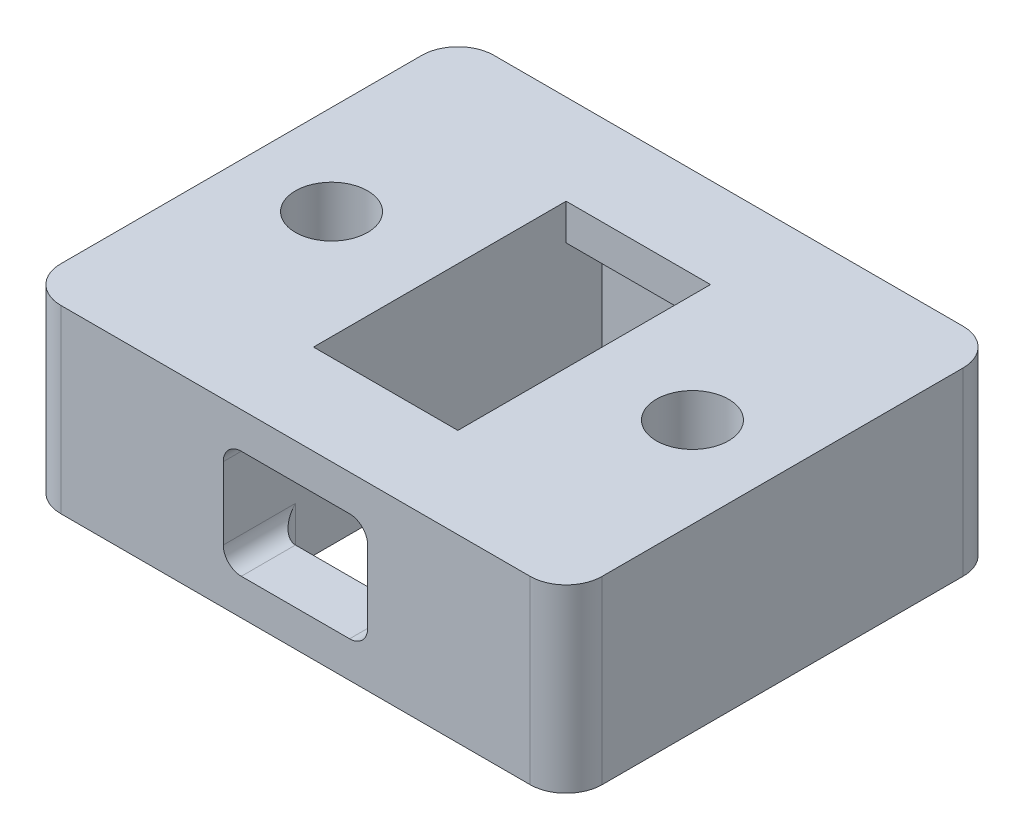
ISO-10303-21;
HEADER;
FILE_DESCRIPTION(('STEP AP214'),'2;1');
FILE_NAME('part.step','',(''),(''),'','','');
FILE_SCHEMA(('AUTOMOTIVE_DESIGN { 1 0 10303 214 1 1 1 1 }'));
ENDSEC;
DATA;
#1=APPLICATION_CONTEXT('core data for automotive mechanical design processes');
#2=APPLICATION_PROTOCOL_DEFINITION('international standard','automotive_design',2000,#1);
#3=PRODUCT_CONTEXT('',#1,'mechanical');
#4=PRODUCT('Part','Part','',(#3));
#5=PRODUCT_RELATED_PRODUCT_CATEGORY('part','',(#4));
#6=PRODUCT_DEFINITION_FORMATION('','',#4);
#7=PRODUCT_DEFINITION_CONTEXT('part definition',#1,'design');
#8=PRODUCT_DEFINITION('design','',#6,#7);
#9=PRODUCT_DEFINITION_SHAPE('','',#8);
#10=(LENGTH_UNIT() NAMED_UNIT(*) SI_UNIT(.MILLI.,.METRE.));
#11=(NAMED_UNIT(*) PLANE_ANGLE_UNIT() SI_UNIT($,.RADIAN.));
#12=(NAMED_UNIT(*) SI_UNIT($,.STERADIAN.) SOLID_ANGLE_UNIT());
#13=UNCERTAINTY_MEASURE_WITH_UNIT(LENGTH_MEASURE(1.E-05),#10,'distance_accuracy_value','');
#14=(GEOMETRIC_REPRESENTATION_CONTEXT(3) GLOBAL_UNCERTAINTY_ASSIGNED_CONTEXT((#13)) GLOBAL_UNIT_ASSIGNED_CONTEXT((#10,
#11,#12)) REPRESENTATION_CONTEXT('',''));
#15=CARTESIAN_POINT('',(0.,0.,0.));
#16=DIRECTION('',(0.,0.,1.));
#17=DIRECTION('',(1.,0.,0.));
#18=AXIS2_PLACEMENT_3D('',#15,#16,#17);
#19=CARTESIAN_POINT('',(-5.08,-12.7,0.));
#20=DIRECTION('',(-1.,0.,0.));
#21=DIRECTION('',(0.,0.,1.));
#22=AXIS2_PLACEMENT_3D('',#19,#20,#21);
#23=PLANE('',#22);
#24=DIRECTION('',(0.,0.,-1.));
#25=VECTOR('',#24,1.);
#26=CARTESIAN_POINT('',(-5.08,-8.89,11.43));
#27=LINE('',#26,#25);
#28=CARTESIAN_POINT('',(-5.08,-8.89,15.24));
#29=VERTEX_POINT('',#28);
#30=CARTESIAN_POINT('',(-5.08,-8.89,10.16));
#31=VERTEX_POINT('',#30);
#32=EDGE_CURVE('E331',#29,#31,#27,.T.);
#33=ORIENTED_EDGE('',*,*,#32,.T.);
#34=DIRECTION('',(0.,1.,0.));
#35=VECTOR('',#34,1.);
#36=CARTESIAN_POINT('',(-5.08,-12.7,10.16));
#37=LINE('',#36,#35);
#38=CARTESIAN_POINT('',(-5.08,-12.7,10.16));
#39=VERTEX_POINT('',#38);
#40=EDGE_CURVE('E333',#31,#39,#37,.F.);
#41=ORIENTED_EDGE('',*,*,#40,.T.);
#42=DIRECTION('',(0.,0.,1.));
#43=VECTOR('',#42,1.);
#44=CARTESIAN_POINT('',(-5.08,-12.7,0.));
#45=LINE('',#44,#43);
#46=CARTESIAN_POINT('',(-5.08,-12.7,-11.43));
#47=VERTEX_POINT('',#46);
#48=EDGE_CURVE('E254',#47,#39,#45,.T.);
#49=ORIENTED_EDGE('',*,*,#48,.F.);
#50=DIRECTION('',(0.,1.,0.));
#51=VECTOR('',#50,1.);
#52=CARTESIAN_POINT('',(-5.08,-12.7,-11.43));
#53=LINE('',#52,#51);
#54=CARTESIAN_POINT('',(-5.08,-2.54,-11.43));
#55=VERTEX_POINT('',#54);
#56=EDGE_CURVE('E217',#47,#55,#53,.T.);
#57=ORIENTED_EDGE('',*,*,#56,.T.);
#58=DIRECTION('',(0.,0.,-1.));
#59=VECTOR('',#58,1.);
#60=CARTESIAN_POINT('',(-5.08,-2.54,-8.89));
#61=LINE('',#60,#59);
#62=CARTESIAN_POINT('',(-5.08,-2.54,-8.89));
#63=VERTEX_POINT('',#62);
#64=EDGE_CURVE('E198',#63,#55,#61,.T.);
#65=ORIENTED_EDGE('',*,*,#64,.F.);
#66=DIRECTION('',(0.,-1.,0.));
#67=VECTOR('',#66,1.);
#68=CARTESIAN_POINT('',(-5.08,0.,-8.89));
#69=LINE('',#68,#67);
#70=CARTESIAN_POINT('',(-5.08,0.,-8.89));
#71=VERTEX_POINT('',#70);
#72=EDGE_CURVE('E205',#71,#63,#69,.T.);
#73=ORIENTED_EDGE('',*,*,#72,.F.);
#74=DIRECTION('',(0.,0.,1.));
#75=VECTOR('',#74,1.);
#76=CARTESIAN_POINT('',(-5.08,0.,0.));
#77=LINE('',#76,#75);
#78=CARTESIAN_POINT('',(-5.08,0.,8.89));
#79=VERTEX_POINT('',#78);
#80=EDGE_CURVE('E230',#71,#79,#77,.T.);
#81=ORIENTED_EDGE('',*,*,#80,.T.);
#82=DIRECTION('',(0.,1.,0.));
#83=VECTOR('',#82,1.);
#84=CARTESIAN_POINT('',(-5.08,0.,8.89));
#85=LINE('',#84,#83);
#86=CARTESIAN_POINT('',(-5.08,-3.81,8.89));
#87=VERTEX_POINT('',#86);
#88=EDGE_CURVE('E408',#87,#79,#85,.T.);
#89=ORIENTED_EDGE('',*,*,#88,.F.);
#90=DIRECTION('',(0.,0.,1.));
#91=VECTOR('',#90,1.);
#92=CARTESIAN_POINT('',(-5.08,-3.81,15.24));
#93=LINE('',#92,#91);
#94=CARTESIAN_POINT('',(-5.08,-3.81,15.24));
#95=VERTEX_POINT('',#94);
#96=EDGE_CURVE('E328',#87,#95,#93,.T.);
#97=ORIENTED_EDGE('',*,*,#96,.T.);
#98=DIRECTION('',(0.,1.,0.));
#99=VECTOR('',#98,1.);
#100=CARTESIAN_POINT('',(-5.08,-2.54,15.24));
#101=LINE('',#100,#99);
#102=EDGE_CURVE('E402',#29,#95,#101,.T.);
#103=ORIENTED_EDGE('',*,*,#102,.F.);
#104=EDGE_LOOP('',(#33,#41,#49,#57,#65,#73,#81,#89,#97,#103));
#105=FACE_BOUND('',#104,.T.);
#106=ADVANCED_FACE('F39',(#105),#23,.F.);
#107=CARTESIAN_POINT('',(5.08,-12.7,0.));
#108=DIRECTION('',(-1.,0.,0.));
#109=DIRECTION('',(0.,0.,1.));
#110=AXIS2_PLACEMENT_3D('',#107,#108,#109);
#111=PLANE('',#110);
#112=DIRECTION('',(0.,0.,1.));
#113=VECTOR('',#112,1.);
#114=CARTESIAN_POINT('',(5.08,-12.7,0.));
#115=LINE('',#114,#113);
#116=CARTESIAN_POINT('',(5.08,-12.7,-11.43));
#117=VERTEX_POINT('',#116);
#118=CARTESIAN_POINT('',(5.08,-12.7,10.16));
#119=VERTEX_POINT('',#118);
#120=EDGE_CURVE('E248',#117,#119,#115,.T.);
#121=ORIENTED_EDGE('',*,*,#120,.T.);
#122=DIRECTION('',(0.,1.,0.));
#123=VECTOR('',#122,1.);
#124=CARTESIAN_POINT('',(5.08,-12.7,10.16));
#125=LINE('',#124,#123);
#126=CARTESIAN_POINT('',(5.08,-8.89,10.16));
#127=VERTEX_POINT('',#126);
#128=EDGE_CURVE('E320',#119,#127,#125,.T.);
#129=ORIENTED_EDGE('',*,*,#128,.T.);
#130=DIRECTION('',(0.,0.,-1.));
#131=VECTOR('',#130,1.);
#132=CARTESIAN_POINT('',(5.08,-8.89,0.));
#133=LINE('',#132,#131);
#134=CARTESIAN_POINT('',(5.08,-8.89,15.24));
#135=VERTEX_POINT('',#134);
#136=EDGE_CURVE('E318',#127,#135,#133,.F.);
#137=ORIENTED_EDGE('',*,*,#136,.T.);
#138=DIRECTION('',(0.,-1.,0.));
#139=VECTOR('',#138,1.);
#140=CARTESIAN_POINT('',(5.08,-2.54,15.24));
#141=LINE('',#140,#139);
#142=CARTESIAN_POINT('',(5.08,-3.81,15.24));
#143=VERTEX_POINT('',#142);
#144=EDGE_CURVE('E364',#143,#135,#141,.T.);
#145=ORIENTED_EDGE('',*,*,#144,.F.);
#146=DIRECTION('',(0.,0.,1.));
#147=VECTOR('',#146,1.);
#148=CARTESIAN_POINT('',(5.08,-3.81,0.));
#149=LINE('',#148,#147);
#150=CARTESIAN_POINT('',(5.08,-3.81,8.89));
#151=VERTEX_POINT('',#150);
#152=EDGE_CURVE('E315',#143,#151,#149,.F.);
#153=ORIENTED_EDGE('',*,*,#152,.T.);
#154=DIRECTION('',(0.,-1.,0.));
#155=VECTOR('',#154,1.);
#156=CARTESIAN_POINT('',(5.08,0.,8.89));
#157=LINE('',#156,#155);
#158=CARTESIAN_POINT('',(5.08,0.,8.89));
#159=VERTEX_POINT('',#158);
#160=EDGE_CURVE('E418',#159,#151,#157,.T.);
#161=ORIENTED_EDGE('',*,*,#160,.F.);
#162=DIRECTION('',(0.,0.,1.));
#163=VECTOR('',#162,1.);
#164=CARTESIAN_POINT('',(5.08,0.,0.));
#165=LINE('',#164,#163);
#166=CARTESIAN_POINT('',(5.08,0.,-8.89));
#167=VERTEX_POINT('',#166);
#168=EDGE_CURVE('E272',#167,#159,#165,.T.);
#169=ORIENTED_EDGE('',*,*,#168,.F.);
#170=DIRECTION('',(0.,1.,0.));
#171=VECTOR('',#170,1.);
#172=CARTESIAN_POINT('',(5.08,0.,-8.89));
#173=LINE('',#172,#171);
#174=CARTESIAN_POINT('',(5.08,-2.54,-8.89));
#175=VERTEX_POINT('',#174);
#176=EDGE_CURVE('E204',#175,#167,#173,.T.);
#177=ORIENTED_EDGE('',*,*,#176,.F.);
#178=DIRECTION('',(0.,0.,-1.));
#179=VECTOR('',#178,1.);
#180=CARTESIAN_POINT('',(5.08,-2.54,-8.89));
#181=LINE('',#180,#179);
#182=CARTESIAN_POINT('',(5.08,-2.54,-11.43));
#183=VERTEX_POINT('',#182);
#184=EDGE_CURVE('E201',#175,#183,#181,.T.);
#185=ORIENTED_EDGE('',*,*,#184,.T.);
#186=DIRECTION('',(0.,1.,0.));
#187=VECTOR('',#186,1.);
#188=CARTESIAN_POINT('',(5.08,-12.7,-11.43));
#189=LINE('',#188,#187);
#190=EDGE_CURVE('E256',#117,#183,#189,.T.);
#191=ORIENTED_EDGE('',*,*,#190,.F.);
#192=EDGE_LOOP('',(#121,#129,#137,#145,#153,#161,#169,#177,#185,#191));
#193=FACE_BOUND('',#192,.T.);
#194=ADVANCED_FACE('F393',(#193),#111,.T.);
#195=CARTESIAN_POINT('',(0.,-12.7,11.43));
#196=DIRECTION('',(0.,0.,1.));
#197=DIRECTION('',(1.,0.,0.));
#198=AXIS2_PLACEMENT_3D('',#195,#196,#197);
#199=PLANE('',#198);
#200=DIRECTION('',(-1.,0.,0.));
#201=VECTOR('',#200,1.);
#202=CARTESIAN_POINT('',(5.08,-10.16,11.43));
#203=LINE('',#202,#201);
#204=CARTESIAN_POINT('',(3.81,-10.16,11.43));
#205=VERTEX_POINT('',#204);
#206=CARTESIAN_POINT('',(-3.81,-10.16,11.43));
#207=VERTEX_POINT('',#206);
#208=EDGE_CURVE('E357',#205,#207,#203,.T.);
#209=ORIENTED_EDGE('',*,*,#208,.F.);
#210=DIRECTION('',(0.,1.,0.));
#211=VECTOR('',#210,1.);
#212=CARTESIAN_POINT('',(3.81,-12.7,11.43));
#213=LINE('',#212,#211);
#214=CARTESIAN_POINT('',(3.81,-12.7,11.43));
#215=VERTEX_POINT('',#214);
#216=EDGE_CURVE('E326',#205,#215,#213,.F.);
#217=ORIENTED_EDGE('',*,*,#216,.T.);
#218=DIRECTION('',(1.,0.,0.));
#219=VECTOR('',#218,1.);
#220=CARTESIAN_POINT('',(0.,-12.7,11.43));
#221=LINE('',#220,#219);
#222=CARTESIAN_POINT('',(-3.81,-12.7,11.43));
#223=VERTEX_POINT('',#222);
#224=EDGE_CURVE('E251',#223,#215,#221,.T.);
#225=ORIENTED_EDGE('',*,*,#224,.F.);
#226=DIRECTION('',(0.,1.,0.));
#227=VECTOR('',#226,1.);
#228=CARTESIAN_POINT('',(-3.81,-10.16,11.43));
#229=LINE('',#228,#227);
#230=EDGE_CURVE('E323',#223,#207,#229,.T.);
#231=ORIENTED_EDGE('',*,*,#230,.T.);
#232=EDGE_LOOP('',(#209,#217,#225,#231));
#233=FACE_BOUND('',#232,.T.);
#234=ADVANCED_FACE('F383',(#233),#199,.F.);
#235=CARTESIAN_POINT('',(0.,-12.7,-11.43));
#236=DIRECTION('',(0.,0.,1.));
#237=DIRECTION('',(1.,0.,0.));
#238=AXIS2_PLACEMENT_3D('',#235,#236,#237);
#239=PLANE('',#238);
#240=ORIENTED_EDGE('',*,*,#190,.T.);
#241=DIRECTION('',(1.,0.,0.));
#242=VECTOR('',#241,1.);
#243=CARTESIAN_POINT('',(-5.08,-2.54,-11.43));
#244=LINE('',#243,#242);
#245=EDGE_CURVE('E213',#55,#183,#244,.T.);
#246=ORIENTED_EDGE('',*,*,#245,.F.);
#247=ORIENTED_EDGE('',*,*,#56,.F.);
#248=DIRECTION('',(1.,0.,0.));
#249=VECTOR('',#248,1.);
#250=CARTESIAN_POINT('',(0.,-12.7,-11.43));
#251=LINE('',#250,#249);
#252=EDGE_CURVE('E245',#47,#117,#251,.T.);
#253=ORIENTED_EDGE('',*,*,#252,.T.);
#254=EDGE_LOOP('',(#240,#246,#247,#253));
#255=FACE_BOUND('',#254,.T.);
#256=ADVANCED_FACE('F425',(#255),#239,.T.);
#257=CARTESIAN_POINT('',(19.05,-12.7,0.));
#258=DIRECTION('',(-1.,0.,0.));
#259=DIRECTION('',(0.,0.,1.));
#260=AXIS2_PLACEMENT_3D('',#257,#258,#259);
#261=PLANE('',#260);
#262=DIRECTION('',(0.,0.,1.));
#263=VECTOR('',#262,1.);
#264=CARTESIAN_POINT('',(19.05,0.,0.));
#265=LINE('',#264,#263);
#266=CARTESIAN_POINT('',(19.05,0.,-12.7));
#267=VERTEX_POINT('',#266);
#268=CARTESIAN_POINT('',(19.05,0.,12.7));
#269=VERTEX_POINT('',#268);
#270=EDGE_CURVE('E260',#267,#269,#265,.T.);
#271=ORIENTED_EDGE('',*,*,#270,.T.);
#272=DIRECTION('',(0.,1.,0.));
#273=VECTOR('',#272,1.);
#274=CARTESIAN_POINT('',(19.05,-12.7,12.7));
#275=LINE('',#274,#273);
#276=CARTESIAN_POINT('',(19.05,-12.7,12.7));
#277=VERTEX_POINT('',#276);
#278=EDGE_CURVE('E308',#269,#277,#275,.F.);
#279=ORIENTED_EDGE('',*,*,#278,.T.);
#280=DIRECTION('',(0.,0.,1.));
#281=VECTOR('',#280,1.);
#282=CARTESIAN_POINT('',(19.05,-12.7,0.));
#283=LINE('',#282,#281);
#284=CARTESIAN_POINT('',(19.05,-12.7,-12.7));
#285=VERTEX_POINT('',#284);
#286=EDGE_CURVE('E233',#285,#277,#283,.T.);
#287=ORIENTED_EDGE('',*,*,#286,.F.);
#288=DIRECTION('',(0.,1.,0.));
#289=VECTOR('',#288,1.);
#290=CARTESIAN_POINT('',(19.05,-12.7,-12.7));
#291=LINE('',#290,#289);
#292=EDGE_CURVE('E305',#285,#267,#291,.T.);
#293=ORIENTED_EDGE('',*,*,#292,.T.);
#294=EDGE_LOOP('',(#271,#279,#287,#293));
#295=FACE_BOUND('',#294,.T.);
#296=ADVANCED_FACE('F427',(#295),#261,.F.);
#297=CARTESIAN_POINT('',(0.,-12.7,15.24));
#298=DIRECTION('',(0.,0.,1.));
#299=DIRECTION('',(1.,0.,0.));
#300=AXIS2_PLACEMENT_3D('',#297,#298,#299);
#301=PLANE('',#300);
#302=DIRECTION('',(1.,0.,0.));
#303=VECTOR('',#302,1.);
#304=CARTESIAN_POINT('',(5.08,-2.54,15.24));
#305=LINE('',#304,#303);
#306=CARTESIAN_POINT('',(-3.81,-2.54,15.24));
#307=VERTEX_POINT('',#306);
#308=CARTESIAN_POINT('',(3.81,-2.54,15.24));
#309=VERTEX_POINT('',#308);
#310=EDGE_CURVE('E405',#307,#309,#305,.T.);
#311=ORIENTED_EDGE('',*,*,#310,.T.);
#312=CARTESIAN_POINT('',(3.81,-3.81,15.24));
#313=DIRECTION('',(0.,0.,1.));
#314=DIRECTION('',(1.,0.,0.));
#315=AXIS2_PLACEMENT_3D('',#312,#313,#314);
#316=CIRCLE('',#315,1.27);
#317=EDGE_CURVE('E48',#309,#143,#316,.F.);
#318=ORIENTED_EDGE('',*,*,#317,.T.);
#319=ORIENTED_EDGE('',*,*,#144,.T.);
#320=CARTESIAN_POINT('',(3.81,-8.89,15.24));
#321=DIRECTION('',(0.,0.,1.));
#322=DIRECTION('',(1.,0.,0.));
#323=AXIS2_PLACEMENT_3D('',#320,#321,#322);
#324=CIRCLE('',#323,1.27);
#325=CARTESIAN_POINT('',(3.81,-10.16,15.24));
#326=VERTEX_POINT('',#325);
#327=EDGE_CURVE('E347',#135,#326,#324,.F.);
#328=ORIENTED_EDGE('',*,*,#327,.T.);
#329=DIRECTION('',(-1.,0.,0.));
#330=VECTOR('',#329,1.);
#331=CARTESIAN_POINT('',(5.08,-10.16,15.24));
#332=LINE('',#331,#330);
#333=CARTESIAN_POINT('',(-3.81,-10.16,15.24));
#334=VERTEX_POINT('',#333);
#335=EDGE_CURVE('E386',#326,#334,#332,.T.);
#336=ORIENTED_EDGE('',*,*,#335,.T.);
#337=CARTESIAN_POINT('',(-3.81,-8.89,15.24));
#338=DIRECTION('',(0.,0.,1.));
#339=DIRECTION('',(1.,0.,0.));
#340=AXIS2_PLACEMENT_3D('',#337,#338,#339);
#341=CIRCLE('',#340,1.27);
#342=EDGE_CURVE('E349',#334,#29,#341,.F.);
#343=ORIENTED_EDGE('',*,*,#342,.T.);
#344=ORIENTED_EDGE('',*,*,#102,.T.);
#345=CARTESIAN_POINT('',(-3.81,-3.81,15.24));
#346=DIRECTION('',(0.,0.,1.));
#347=DIRECTION('',(1.,0.,0.));
#348=AXIS2_PLACEMENT_3D('',#345,#346,#347);
#349=CIRCLE('',#348,1.27);
#350=EDGE_CURVE('E351',#95,#307,#349,.F.);
#351=ORIENTED_EDGE('',*,*,#350,.T.);
#352=EDGE_LOOP('',(#311,#318,#319,#328,#336,#343,#344,#351));
#353=FACE_BOUND('',#352,.T.);
#354=DIRECTION('',(1.,0.,0.));
#355=VECTOR('',#354,1.);
#356=CARTESIAN_POINT('',(0.,0.,15.24));
#357=LINE('',#356,#355);
#358=CARTESIAN_POINT('',(-16.51,0.,15.24));
#359=VERTEX_POINT('',#358);
#360=CARTESIAN_POINT('',(16.51,0.,15.24));
#361=VERTEX_POINT('',#360);
#362=EDGE_CURVE('E269',#359,#361,#357,.T.);
#363=ORIENTED_EDGE('',*,*,#362,.F.);
#364=DIRECTION('',(0.,1.,0.));
#365=VECTOR('',#364,1.);
#366=CARTESIAN_POINT('',(-16.51,-12.7,15.24));
#367=LINE('',#366,#365);
#368=CARTESIAN_POINT('',(-16.51,-12.7,15.24));
#369=VERTEX_POINT('',#368);
#370=EDGE_CURVE('E295',#359,#369,#367,.F.);
#371=ORIENTED_EDGE('',*,*,#370,.T.);
#372=DIRECTION('',(1.,0.,0.));
#373=VECTOR('',#372,1.);
#374=CARTESIAN_POINT('',(0.,-12.7,15.24));
#375=LINE('',#374,#373);
#376=CARTESIAN_POINT('',(16.51,-12.7,15.24));
#377=VERTEX_POINT('',#376);
#378=EDGE_CURVE('E242',#369,#377,#375,.T.);
#379=ORIENTED_EDGE('',*,*,#378,.T.);
#380=DIRECTION('',(0.,1.,0.));
#381=VECTOR('',#380,1.);
#382=CARTESIAN_POINT('',(16.51,0.,15.24));
#383=LINE('',#382,#381);
#384=EDGE_CURVE('E292',#377,#361,#383,.T.);
#385=ORIENTED_EDGE('',*,*,#384,.T.);
#386=EDGE_LOOP('',(#363,#371,#379,#385));
#387=FACE_BOUND('',#386,.T.);
#388=ADVANCED_FACE('F433',(#353,#387),#301,.T.);
#389=CARTESIAN_POINT('',(-19.05,-12.7,0.));
#390=DIRECTION('',(-1.,0.,0.));
#391=DIRECTION('',(0.,0.,1.));
#392=AXIS2_PLACEMENT_3D('',#389,#390,#391);
#393=PLANE('',#392);
#394=DIRECTION('',(0.,0.,1.));
#395=VECTOR('',#394,1.);
#396=CARTESIAN_POINT('',(-19.05,-12.7,0.));
#397=LINE('',#396,#395);
#398=CARTESIAN_POINT('',(-19.05,-12.7,-12.7));
#399=VERTEX_POINT('',#398);
#400=CARTESIAN_POINT('',(-19.05,-12.7,12.7));
#401=VERTEX_POINT('',#400);
#402=EDGE_CURVE('E239',#399,#401,#397,.T.);
#403=ORIENTED_EDGE('',*,*,#402,.T.);
#404=DIRECTION('',(0.,1.,0.));
#405=VECTOR('',#404,1.);
#406=CARTESIAN_POINT('',(-19.05,-12.7,12.7));
#407=LINE('',#406,#405);
#408=CARTESIAN_POINT('',(-19.05,0.,12.7));
#409=VERTEX_POINT('',#408);
#410=EDGE_CURVE('E281',#401,#409,#407,.T.);
#411=ORIENTED_EDGE('',*,*,#410,.T.);
#412=DIRECTION('',(0.,0.,1.));
#413=VECTOR('',#412,1.);
#414=CARTESIAN_POINT('',(-19.05,0.,0.));
#415=LINE('',#414,#413);
#416=CARTESIAN_POINT('',(-19.05,0.,-12.7));
#417=VERTEX_POINT('',#416);
#418=EDGE_CURVE('E266',#417,#409,#415,.T.);
#419=ORIENTED_EDGE('',*,*,#418,.F.);
#420=DIRECTION('',(0.,1.,0.));
#421=VECTOR('',#420,1.);
#422=CARTESIAN_POINT('',(-19.05,-12.7,-12.7));
#423=LINE('',#422,#421);
#424=EDGE_CURVE('E277',#417,#399,#423,.F.);
#425=ORIENTED_EDGE('',*,*,#424,.T.);
#426=EDGE_LOOP('',(#403,#411,#419,#425));
#427=FACE_BOUND('',#426,.T.);
#428=ADVANCED_FACE('F510',(#427),#393,.T.);
#429=CARTESIAN_POINT('',(0.,-12.7,-15.24));
#430=DIRECTION('',(0.,0.,1.));
#431=DIRECTION('',(1.,0.,0.));
#432=AXIS2_PLACEMENT_3D('',#429,#430,#431);
#433=PLANE('',#432);
#434=DIRECTION('',(1.,0.,0.));
#435=VECTOR('',#434,1.);
#436=CARTESIAN_POINT('',(0.,0.,-15.24));
#437=LINE('',#436,#435);
#438=CARTESIAN_POINT('',(-16.51,0.,-15.24));
#439=VERTEX_POINT('',#438);
#440=CARTESIAN_POINT('',(16.51,0.,-15.24));
#441=VERTEX_POINT('',#440);
#442=EDGE_CURVE('E263',#439,#441,#437,.T.);
#443=ORIENTED_EDGE('',*,*,#442,.T.);
#444=DIRECTION('',(0.,1.,0.));
#445=VECTOR('',#444,1.);
#446=CARTESIAN_POINT('',(16.51,-12.7,-15.24));
#447=LINE('',#446,#445);
#448=CARTESIAN_POINT('',(16.51,-12.7,-15.24));
#449=VERTEX_POINT('',#448);
#450=EDGE_CURVE('E313',#441,#449,#447,.F.);
#451=ORIENTED_EDGE('',*,*,#450,.T.);
#452=DIRECTION('',(1.,0.,0.));
#453=VECTOR('',#452,1.);
#454=CARTESIAN_POINT('',(0.,-12.7,-15.24));
#455=LINE('',#454,#453);
#456=CARTESIAN_POINT('',(-16.51,-12.7,-15.24));
#457=VERTEX_POINT('',#456);
#458=EDGE_CURVE('E236',#457,#449,#455,.T.);
#459=ORIENTED_EDGE('',*,*,#458,.F.);
#460=DIRECTION('',(0.,1.,0.));
#461=VECTOR('',#460,1.);
#462=CARTESIAN_POINT('',(-16.51,0.,-15.24));
#463=LINE('',#462,#461);
#464=EDGE_CURVE('E310',#457,#439,#463,.T.);
#465=ORIENTED_EDGE('',*,*,#464,.T.);
#466=EDGE_LOOP('',(#443,#451,#459,#465));
#467=FACE_BOUND('',#466,.T.);
#468=ADVANCED_FACE('F519',(#467),#433,.F.);
#469=CARTESIAN_POINT('',(-12.7,-12.7,0.));
#470=DIRECTION('',(0.,1.,0.));
#471=DIRECTION('',(0.,0.,1.));
#472=AXIS2_PLACEMENT_3D('',#469,#470,#471);
#473=CYLINDRICAL_SURFACE('',#472,2.54);
#474=CARTESIAN_POINT('',(-12.7,-12.7,0.));
#475=DIRECTION('',(0.,1.,0.));
#476=DIRECTION('',(0.,0.,1.));
#477=AXIS2_PLACEMENT_3D('',#474,#475,#476);
#478=CIRCLE('',#477,2.54);
#479=CARTESIAN_POINT('',(-12.7,-12.7,2.54));
#480=VERTEX_POINT('',#479);
#481=EDGE_CURVE('E229',#480,#480,#478,.T.);
#482=CARTESIAN_POINT('',(-12.7,0.,0.));
#483=DIRECTION('',(0.,1.,0.));
#484=DIRECTION('',(0.,0.,1.));
#485=AXIS2_PLACEMENT_3D('',#482,#483,#484);
#486=CIRCLE('',#485,2.54);
#487=CARTESIAN_POINT('',(-12.7,0.,2.54));
#488=VERTEX_POINT('',#487);
#489=EDGE_CURVE('E221',#488,#488,#486,.T.);
#490=CARTESIAN_POINT('',(-12.7,-12.7,2.54));
#491=CARTESIAN_POINT('',(-12.7,-12.5677083333333,2.54));
#492=CARTESIAN_POINT('',(-12.7,-12.4354166666667,2.54));
#493=CARTESIAN_POINT('',(-12.7,-12.1708333333333,2.54));
#494=CARTESIAN_POINT('',(-12.7,-12.0385416666667,2.54));
#495=CARTESIAN_POINT('',(-12.7,-11.7739583333333,2.54));
#496=CARTESIAN_POINT('',(-12.7,-11.6416666666667,2.54));
#497=CARTESIAN_POINT('',(-12.7,-11.3770833333333,2.54));
#498=CARTESIAN_POINT('',(-12.7,-11.2447916666667,2.54));
#499=CARTESIAN_POINT('',(-12.7,-10.9802083333333,2.54));
#500=CARTESIAN_POINT('',(-12.7,-10.8479166666667,2.54));
#501=CARTESIAN_POINT('',(-12.7,-10.5833333333333,2.54));
#502=CARTESIAN_POINT('',(-12.7,-10.4510416666667,2.54));
#503=CARTESIAN_POINT('',(-12.7,-10.1864583333333,2.54));
#504=CARTESIAN_POINT('',(-12.7,-10.0541666666667,2.54));
#505=CARTESIAN_POINT('',(-12.7,-9.78958333333334,2.54));
#506=CARTESIAN_POINT('',(-12.7,-9.65729166666667,2.54));
#507=CARTESIAN_POINT('',(-12.7,-9.39270833333333,2.54));
#508=CARTESIAN_POINT('',(-12.7,-9.26041666666667,2.54));
#509=CARTESIAN_POINT('',(-12.7,-8.99583333333334,2.54));
#510=CARTESIAN_POINT('',(-12.7,-8.86354166666667,2.54));
#511=CARTESIAN_POINT('',(-12.7,-8.59895833333334,2.54));
#512=CARTESIAN_POINT('',(-12.7,-8.46666666666667,2.54));
#513=CARTESIAN_POINT('',(-12.7,-8.20208333333334,2.54));
#514=CARTESIAN_POINT('',(-12.7,-8.06979166666667,2.54));
#515=CARTESIAN_POINT('',(-12.7,-7.80520833333333,2.54));
#516=CARTESIAN_POINT('',(-12.7,-7.67291666666667,2.54));
#517=CARTESIAN_POINT('',(-12.7,-7.40833333333333,2.54));
#518=CARTESIAN_POINT('',(-12.7,-7.27604166666667,2.54));
#519=CARTESIAN_POINT('',(-12.7,-7.01145833333333,2.54));
#520=CARTESIAN_POINT('',(-12.7,-6.87916666666667,2.54));
#521=CARTESIAN_POINT('',(-12.7,-6.61458333333333,2.54));
#522=CARTESIAN_POINT('',(-12.7,-6.48229166666667,2.54));
#523=CARTESIAN_POINT('',(-12.7,-6.21770833333333,2.54));
#524=CARTESIAN_POINT('',(-12.7,-6.08541666666667,2.54));
#525=CARTESIAN_POINT('',(-12.7,-5.82083333333333,2.54));
#526=CARTESIAN_POINT('',(-12.7,-5.68854166666667,2.54));
#527=CARTESIAN_POINT('',(-12.7,-5.42395833333333,2.54));
#528=CARTESIAN_POINT('',(-12.7,-5.29166666666667,2.54));
#529=CARTESIAN_POINT('',(-12.7,-5.02708333333333,2.54));
#530=CARTESIAN_POINT('',(-12.7,-4.89479166666667,2.54));
#531=CARTESIAN_POINT('',(-12.7,-4.63020833333333,2.54));
#532=CARTESIAN_POINT('',(-12.7,-4.49791666666667,2.54));
#533=CARTESIAN_POINT('',(-12.7,-4.23333333333333,2.54));
#534=CARTESIAN_POINT('',(-12.7,-4.10104166666667,2.54));
#535=CARTESIAN_POINT('',(-12.7,-3.83645833333333,2.54));
#536=CARTESIAN_POINT('',(-12.7,-3.70416666666667,2.54));
#537=CARTESIAN_POINT('',(-12.7,-3.43958333333333,2.54));
#538=CARTESIAN_POINT('',(-12.7,-3.30729166666667,2.54));
#539=CARTESIAN_POINT('',(-12.7,-3.04270833333333,2.54));
#540=CARTESIAN_POINT('',(-12.7,-2.91041666666667,2.54));
#541=CARTESIAN_POINT('',(-12.7,-2.64583333333333,2.54));
#542=CARTESIAN_POINT('',(-12.7,-2.51354166666667,2.54));
#543=CARTESIAN_POINT('',(-12.7,-2.24895833333333,2.54));
#544=CARTESIAN_POINT('',(-12.7,-2.11666666666667,2.54));
#545=CARTESIAN_POINT('',(-12.7,-1.85208333333333,2.54));
#546=CARTESIAN_POINT('',(-12.7,-1.71979166666667,2.54));
#547=CARTESIAN_POINT('',(-12.7,-1.45520833333333,2.54));
#548=CARTESIAN_POINT('',(-12.7,-1.32291666666667,2.54));
#549=CARTESIAN_POINT('',(-12.7,-1.05833333333333,2.54));
#550=CARTESIAN_POINT('',(-12.7,-0.926041666666666,2.54));
#551=CARTESIAN_POINT('',(-12.7,-0.661458333333333,2.54));
#552=CARTESIAN_POINT('',(-12.7,-0.529166666666666,2.54));
#553=CARTESIAN_POINT('',(-12.7,-0.264583333333333,2.54));
#554=CARTESIAN_POINT('',(-12.7,-0.132291666666667,2.54));
#555=CARTESIAN_POINT('',(-12.7,0.,2.54));
#556=B_SPLINE_CURVE_WITH_KNOTS('',3,(#490,#491,#492,#493,#494,#495,#496,#497,#498,#499,#500,
#501,#502,#503,#504,#505,#506,#507,#508,#509,#510,#511,#512,#513,#514,#515,#516,#517,#518,#519,
#520,#521,#522,#523,#524,#525,#526,#527,#528,#529,#530,#531,#532,#533,#534,#535,#536,#537,#538,
#539,#540,#541,#542,#543,#544,#545,#546,#547,#548,#549,#550,#551,#552,#553,#554,#555),
.UNSPECIFIED.,.F.,.F.,(4,2,2,2,2,2,2,2,2,2,2,2,2,2,2,2,2,2,2,2,2,2,2,2,2,2,2,2,2,2,2,2,4),(0.,
0.396875,0.793749999999999,1.190625,1.5875,1.984375,2.38125,2.778125,3.175,3.571875,3.96875,
4.365625,4.7625,5.159375,5.55625,5.953125,6.35,6.746875,7.14375,7.540625,7.9375,8.334375,
8.73125,9.128125,9.525,9.921875,10.31875,10.715625,11.1125,11.509375,11.90625,12.303125,12.7),.UNSPECIFIED.);
#557=EDGE_CURVE('BSEAM539',#480,#488,#556,.T.);
#558=ORIENTED_EDGE('',*,*,#481,.F.);
#559=ORIENTED_EDGE('',*,*,#489,.T.);
#560=ORIENTED_EDGE('',*,*,#557,.T.);
#561=ORIENTED_EDGE('',*,*,#557,.F.);
#562=EDGE_LOOP('',(#558,#560,#559,#561));
#563=FACE_BOUND('',#562,.T.);
#564=ADVANCED_FACE('F539',(#563),#473,.F.);
#565=CARTESIAN_POINT('',(12.7,-12.7,0.));
#566=DIRECTION('',(0.,1.,0.));
#567=DIRECTION('',(0.,0.,1.));
#568=AXIS2_PLACEMENT_3D('',#565,#566,#567);
#569=CYLINDRICAL_SURFACE('',#568,2.54);
#570=CARTESIAN_POINT('',(12.7,-12.7,0.));
#571=DIRECTION('',(0.,1.,0.));
#572=DIRECTION('',(0.,0.,1.));
#573=AXIS2_PLACEMENT_3D('',#570,#571,#572);
#574=CIRCLE('',#573,2.54);
#575=CARTESIAN_POINT('',(12.7,-12.7,2.54));
#576=VERTEX_POINT('',#575);
#577=EDGE_CURVE('E226',#576,#576,#574,.T.);
#578=CARTESIAN_POINT('',(12.7,0.,0.));
#579=DIRECTION('',(0.,1.,0.));
#580=DIRECTION('',(0.,0.,1.));
#581=AXIS2_PLACEMENT_3D('',#578,#579,#580);
#582=CIRCLE('',#581,2.54);
#583=CARTESIAN_POINT('',(12.7,0.,2.54));
#584=VERTEX_POINT('',#583);
#585=EDGE_CURVE('E218',#584,#584,#582,.T.);
#586=CARTESIAN_POINT('',(12.7,-12.7,2.54));
#587=CARTESIAN_POINT('',(12.7,-12.5677083333333,2.54));
#588=CARTESIAN_POINT('',(12.7,-12.4354166666667,2.54));
#589=CARTESIAN_POINT('',(12.7,-12.1708333333333,2.54));
#590=CARTESIAN_POINT('',(12.7,-12.0385416666667,2.54));
#591=CARTESIAN_POINT('',(12.7,-11.7739583333333,2.54));
#592=CARTESIAN_POINT('',(12.7,-11.6416666666667,2.54));
#593=CARTESIAN_POINT('',(12.7,-11.3770833333333,2.54));
#594=CARTESIAN_POINT('',(12.7,-11.2447916666667,2.54));
#595=CARTESIAN_POINT('',(12.7,-10.9802083333333,2.54));
#596=CARTESIAN_POINT('',(12.7,-10.8479166666667,2.54));
#597=CARTESIAN_POINT('',(12.7,-10.5833333333333,2.54));
#598=CARTESIAN_POINT('',(12.7,-10.4510416666667,2.54));
#599=CARTESIAN_POINT('',(12.7,-10.1864583333333,2.54));
#600=CARTESIAN_POINT('',(12.7,-10.0541666666667,2.54));
#601=CARTESIAN_POINT('',(12.7,-9.78958333333334,2.54));
#602=CARTESIAN_POINT('',(12.7,-9.65729166666667,2.54));
#603=CARTESIAN_POINT('',(12.7,-9.39270833333333,2.54));
#604=CARTESIAN_POINT('',(12.7,-9.26041666666667,2.54));
#605=CARTESIAN_POINT('',(12.7,-8.99583333333334,2.54));
#606=CARTESIAN_POINT('',(12.7,-8.86354166666667,2.54));
#607=CARTESIAN_POINT('',(12.7,-8.59895833333334,2.54));
#608=CARTESIAN_POINT('',(12.7,-8.46666666666667,2.54));
#609=CARTESIAN_POINT('',(12.7,-8.20208333333334,2.54));
#610=CARTESIAN_POINT('',(12.7,-8.06979166666667,2.54));
#611=CARTESIAN_POINT('',(12.7,-7.80520833333333,2.54));
#612=CARTESIAN_POINT('',(12.7,-7.67291666666667,2.54));
#613=CARTESIAN_POINT('',(12.7,-7.40833333333333,2.54));
#614=CARTESIAN_POINT('',(12.7,-7.27604166666667,2.54));
#615=CARTESIAN_POINT('',(12.7,-7.01145833333333,2.54));
#616=CARTESIAN_POINT('',(12.7,-6.87916666666667,2.54));
#617=CARTESIAN_POINT('',(12.7,-6.61458333333333,2.54));
#618=CARTESIAN_POINT('',(12.7,-6.48229166666667,2.54));
#619=CARTESIAN_POINT('',(12.7,-6.21770833333333,2.54));
#620=CARTESIAN_POINT('',(12.7,-6.08541666666667,2.54));
#621=CARTESIAN_POINT('',(12.7,-5.82083333333333,2.54));
#622=CARTESIAN_POINT('',(12.7,-5.68854166666667,2.54));
#623=CARTESIAN_POINT('',(12.7,-5.42395833333333,2.54));
#624=CARTESIAN_POINT('',(12.7,-5.29166666666667,2.54));
#625=CARTESIAN_POINT('',(12.7,-5.02708333333333,2.54));
#626=CARTESIAN_POINT('',(12.7,-4.89479166666667,2.54));
#627=CARTESIAN_POINT('',(12.7,-4.63020833333333,2.54));
#628=CARTESIAN_POINT('',(12.7,-4.49791666666667,2.54));
#629=CARTESIAN_POINT('',(12.7,-4.23333333333333,2.54));
#630=CARTESIAN_POINT('',(12.7,-4.10104166666667,2.54));
#631=CARTESIAN_POINT('',(12.7,-3.83645833333333,2.54));
#632=CARTESIAN_POINT('',(12.7,-3.70416666666667,2.54));
#633=CARTESIAN_POINT('',(12.7,-3.43958333333333,2.54));
#634=CARTESIAN_POINT('',(12.7,-3.30729166666667,2.54));
#635=CARTESIAN_POINT('',(12.7,-3.04270833333333,2.54));
#636=CARTESIAN_POINT('',(12.7,-2.91041666666667,2.54));
#637=CARTESIAN_POINT('',(12.7,-2.64583333333333,2.54));
#638=CARTESIAN_POINT('',(12.7,-2.51354166666667,2.54));
#639=CARTESIAN_POINT('',(12.7,-2.24895833333333,2.54));
#640=CARTESIAN_POINT('',(12.7,-2.11666666666667,2.54));
#641=CARTESIAN_POINT('',(12.7,-1.85208333333333,2.54));
#642=CARTESIAN_POINT('',(12.7,-1.71979166666667,2.54));
#643=CARTESIAN_POINT('',(12.7,-1.45520833333333,2.54));
#644=CARTESIAN_POINT('',(12.7,-1.32291666666667,2.54));
#645=CARTESIAN_POINT('',(12.7,-1.05833333333333,2.54));
#646=CARTESIAN_POINT('',(12.7,-0.926041666666666,2.54));
#647=CARTESIAN_POINT('',(12.7,-0.661458333333333,2.54));
#648=CARTESIAN_POINT('',(12.7,-0.529166666666666,2.54));
#649=CARTESIAN_POINT('',(12.7,-0.264583333333333,2.54));
#650=CARTESIAN_POINT('',(12.7,-0.132291666666667,2.54));
#651=CARTESIAN_POINT('',(12.7,0.,2.54));
#652=B_SPLINE_CURVE_WITH_KNOTS('',3,(#586,#587,#588,#589,#590,#591,#592,#593,#594,#595,#596,
#597,#598,#599,#600,#601,#602,#603,#604,#605,#606,#607,#608,#609,#610,#611,#612,#613,#614,#615,
#616,#617,#618,#619,#620,#621,#622,#623,#624,#625,#626,#627,#628,#629,#630,#631,#632,#633,#634,
#635,#636,#637,#638,#639,#640,#641,#642,#643,#644,#645,#646,#647,#648,#649,#650,#651),
.UNSPECIFIED.,.F.,.F.,(4,2,2,2,2,2,2,2,2,2,2,2,2,2,2,2,2,2,2,2,2,2,2,2,2,2,2,2,2,2,2,2,4),(0.,
0.396875,0.793749999999999,1.190625,1.5875,1.984375,2.38125,2.778125,3.175,3.571875,3.96875,
4.365625,4.7625,5.159375,5.55625,5.953125,6.35,6.746875,7.14375,7.540625,7.9375,8.334375,
8.73125,9.128125,9.525,9.921875,10.31875,10.715625,11.1125,11.509375,11.90625,12.303125,12.7),.UNSPECIFIED.);
#653=EDGE_CURVE('BSEAM451',#576,#584,#652,.T.);
#654=ORIENTED_EDGE('',*,*,#577,.F.);
#655=ORIENTED_EDGE('',*,*,#585,.T.);
#656=ORIENTED_EDGE('',*,*,#653,.T.);
#657=ORIENTED_EDGE('',*,*,#653,.F.);
#658=EDGE_LOOP('',(#654,#656,#655,#657));
#659=FACE_BOUND('',#658,.T.);
#660=ADVANCED_FACE('F451',(#659),#569,.F.);
#661=CARTESIAN_POINT('',(0.,-12.7,0.));
#662=DIRECTION('',(0.,1.,0.));
#663=DIRECTION('',(0.,0.,1.));
#664=AXIS2_PLACEMENT_3D('',#661,#662,#663);
#665=PLANE('',#664);
#666=ORIENTED_EDGE('',*,*,#577,.T.);
#667=EDGE_LOOP('',(#666));
#668=FACE_BOUND('',#667,.T.);
#669=ORIENTED_EDGE('',*,*,#481,.T.);
#670=EDGE_LOOP('',(#669));
#671=FACE_BOUND('',#670,.T.);
#672=ORIENTED_EDGE('',*,*,#378,.F.);
#673=CARTESIAN_POINT('',(-16.51,-12.7,12.7));
#674=DIRECTION('',(0.,1.,0.));
#675=DIRECTION('',(0.,0.,1.));
#676=AXIS2_PLACEMENT_3D('',#673,#674,#675);
#677=CIRCLE('',#676,2.54);
#678=EDGE_CURVE('E303',#369,#401,#677,.F.);
#679=ORIENTED_EDGE('',*,*,#678,.T.);
#680=ORIENTED_EDGE('',*,*,#402,.F.);
#681=CARTESIAN_POINT('',(-16.51,-12.7,-12.7));
#682=DIRECTION('',(0.,1.,0.));
#683=DIRECTION('',(0.,0.,1.));
#684=AXIS2_PLACEMENT_3D('',#681,#682,#683);
#685=CIRCLE('',#684,2.54);
#686=EDGE_CURVE('E297',#399,#457,#685,.F.);
#687=ORIENTED_EDGE('',*,*,#686,.T.);
#688=ORIENTED_EDGE('',*,*,#458,.T.);
#689=CARTESIAN_POINT('',(16.51,-12.7,-12.7));
#690=DIRECTION('',(0.,1.,0.));
#691=DIRECTION('',(0.,0.,1.));
#692=AXIS2_PLACEMENT_3D('',#689,#690,#691);
#693=CIRCLE('',#692,2.54);
#694=EDGE_CURVE('E299',#449,#285,#693,.F.);
#695=ORIENTED_EDGE('',*,*,#694,.T.);
#696=ORIENTED_EDGE('',*,*,#286,.T.);
#697=CARTESIAN_POINT('',(16.51,-12.7,12.7));
#698=DIRECTION('',(0.,1.,0.));
#699=DIRECTION('',(0.,0.,1.));
#700=AXIS2_PLACEMENT_3D('',#697,#698,#699);
#701=CIRCLE('',#700,2.54);
#702=EDGE_CURVE('E301',#277,#377,#701,.F.);
#703=ORIENTED_EDGE('',*,*,#702,.T.);
#704=EDGE_LOOP('',(#672,#679,#680,#687,#688,#695,#696,#703));
#705=FACE_BOUND('',#704,.T.);
#706=ORIENTED_EDGE('',*,*,#252,.F.);
#707=ORIENTED_EDGE('',*,*,#48,.T.);
#708=CARTESIAN_POINT('',(-3.81,-12.7,10.16));
#709=DIRECTION('',(0.,1.,0.));
#710=DIRECTION('',(0.,0.,1.));
#711=AXIS2_PLACEMENT_3D('',#708,#709,#710);
#712=CIRCLE('',#711,1.27);
#713=EDGE_CURVE('E345',#39,#223,#712,.T.);
#714=ORIENTED_EDGE('',*,*,#713,.T.);
#715=ORIENTED_EDGE('',*,*,#224,.T.);
#716=CARTESIAN_POINT('',(3.81,-12.7,10.16));
#717=DIRECTION('',(0.,1.,0.));
#718=DIRECTION('',(0.,0.,1.));
#719=AXIS2_PLACEMENT_3D('',#716,#717,#718);
#720=CIRCLE('',#719,1.27);
#721=EDGE_CURVE('E343',#215,#119,#720,.T.);
#722=ORIENTED_EDGE('',*,*,#721,.T.);
#723=ORIENTED_EDGE('',*,*,#120,.F.);
#724=EDGE_LOOP('',(#706,#707,#714,#715,#722,#723));
#725=FACE_BOUND('',#724,.T.);
#726=ADVANCED_FACE('F399',(#668,#671,#705,#725),#665,.F.);
#727=CARTESIAN_POINT('',(0.,0.,0.));
#728=DIRECTION('',(0.,1.,0.));
#729=DIRECTION('',(0.,0.,1.));
#730=AXIS2_PLACEMENT_3D('',#727,#728,#729);
#731=PLANE('',#730);
#732=ORIENTED_EDGE('',*,*,#80,.F.);
#733=DIRECTION('',(-1.,0.,0.));
#734=VECTOR('',#733,1.);
#735=CARTESIAN_POINT('',(-5.08,0.,-8.89));
#736=LINE('',#735,#734);
#737=EDGE_CURVE('E210',#167,#71,#736,.T.);
#738=ORIENTED_EDGE('',*,*,#737,.F.);
#739=ORIENTED_EDGE('',*,*,#168,.T.);
#740=DIRECTION('',(1.,0.,0.));
#741=VECTOR('',#740,1.);
#742=CARTESIAN_POINT('',(-5.08,0.,8.89));
#743=LINE('',#742,#741);
#744=EDGE_CURVE('E415',#79,#159,#743,.T.);
#745=ORIENTED_EDGE('',*,*,#744,.F.);
#746=EDGE_LOOP('',(#732,#738,#739,#745));
#747=FACE_BOUND('',#746,.T.);
#748=ORIENTED_EDGE('',*,*,#585,.F.);
#749=EDGE_LOOP('',(#748));
#750=FACE_BOUND('',#749,.T.);
#751=ORIENTED_EDGE('',*,*,#489,.F.);
#752=EDGE_LOOP('',(#751));
#753=FACE_BOUND('',#752,.T.);
#754=ORIENTED_EDGE('',*,*,#418,.T.);
#755=CARTESIAN_POINT('',(-16.51,0.,12.7));
#756=DIRECTION('',(0.,1.,0.));
#757=DIRECTION('',(0.,0.,1.));
#758=AXIS2_PLACEMENT_3D('',#755,#756,#757);
#759=CIRCLE('',#758,2.54);
#760=EDGE_CURVE('E290',#409,#359,#759,.T.);
#761=ORIENTED_EDGE('',*,*,#760,.T.);
#762=ORIENTED_EDGE('',*,*,#362,.T.);
#763=CARTESIAN_POINT('',(16.51,0.,12.7));
#764=DIRECTION('',(0.,1.,0.));
#765=DIRECTION('',(0.,0.,1.));
#766=AXIS2_PLACEMENT_3D('',#763,#764,#765);
#767=CIRCLE('',#766,2.54);
#768=EDGE_CURVE('E288',#361,#269,#767,.T.);
#769=ORIENTED_EDGE('',*,*,#768,.T.);
#770=ORIENTED_EDGE('',*,*,#270,.F.);
#771=CARTESIAN_POINT('',(16.51,0.,-12.7));
#772=DIRECTION('',(0.,1.,0.));
#773=DIRECTION('',(0.,0.,1.));
#774=AXIS2_PLACEMENT_3D('',#771,#772,#773);
#775=CIRCLE('',#774,2.54);
#776=EDGE_CURVE('E286',#267,#441,#775,.T.);
#777=ORIENTED_EDGE('',*,*,#776,.T.);
#778=ORIENTED_EDGE('',*,*,#442,.F.);
#779=CARTESIAN_POINT('',(-16.51,0.,-12.7));
#780=DIRECTION('',(0.,1.,0.));
#781=DIRECTION('',(0.,0.,1.));
#782=AXIS2_PLACEMENT_3D('',#779,#780,#781);
#783=CIRCLE('',#782,2.54);
#784=EDGE_CURVE('E284',#439,#417,#783,.T.);
#785=ORIENTED_EDGE('',*,*,#784,.T.);
#786=EDGE_LOOP('',(#754,#761,#762,#769,#770,#777,#778,#785));
#787=FACE_BOUND('',#786,.T.);
#788=ADVANCED_FACE('F445',(#747,#750,#753,#787),#731,.T.);
#789=CARTESIAN_POINT('',(-5.08,-2.54,-8.89));
#790=DIRECTION('',(0.,1.,0.));
#791=DIRECTION('',(0.,0.,1.));
#792=AXIS2_PLACEMENT_3D('',#789,#790,#791);
#793=PLANE('',#792);
#794=ORIENTED_EDGE('',*,*,#245,.T.);
#795=ORIENTED_EDGE('',*,*,#184,.F.);
#796=DIRECTION('',(1.,0.,0.));
#797=VECTOR('',#796,1.);
#798=CARTESIAN_POINT('',(-5.08,-2.54,-8.89));
#799=LINE('',#798,#797);
#800=EDGE_CURVE('E194',#63,#175,#799,.T.);
#801=ORIENTED_EDGE('',*,*,#800,.F.);
#802=ORIENTED_EDGE('',*,*,#64,.T.);
#803=EDGE_LOOP('',(#794,#795,#801,#802));
#804=FACE_BOUND('',#803,.T.);
#805=ADVANCED_FACE('F196',(#804),#793,.F.);
#806=CARTESIAN_POINT('',(0.,0.,-8.89));
#807=DIRECTION('',(0.,0.,1.));
#808=DIRECTION('',(1.,0.,0.));
#809=AXIS2_PLACEMENT_3D('',#806,#807,#808);
#810=PLANE('',#809);
#811=ORIENTED_EDGE('',*,*,#72,.T.);
#812=ORIENTED_EDGE('',*,*,#800,.T.);
#813=ORIENTED_EDGE('',*,*,#176,.T.);
#814=ORIENTED_EDGE('',*,*,#737,.T.);
#815=EDGE_LOOP('',(#811,#812,#813,#814));
#816=FACE_BOUND('',#815,.T.);
#817=ADVANCED_FACE('F208',(#816),#810,.T.);
#818=CARTESIAN_POINT('',(-5.08,-2.54,8.89));
#819=DIRECTION('',(0.,1.,0.));
#820=DIRECTION('',(-1.,0.,0.));
#821=AXIS2_PLACEMENT_3D('',#818,#819,#820);
#822=PLANE('',#821);
#823=ORIENTED_EDGE('',*,*,#310,.F.);
#824=DIRECTION('',(0.,0.,1.));
#825=VECTOR('',#824,1.);
#826=CARTESIAN_POINT('',(-3.81,-2.54,8.89));
#827=LINE('',#826,#825);
#828=CARTESIAN_POINT('',(-3.81,-2.54,8.89));
#829=VERTEX_POINT('',#828);
#830=EDGE_CURVE('E56',#307,#829,#827,.F.);
#831=ORIENTED_EDGE('',*,*,#830,.T.);
#832=DIRECTION('',(-1.,0.,0.));
#833=VECTOR('',#832,1.);
#834=CARTESIAN_POINT('',(-5.08,-2.54,8.89));
#835=LINE('',#834,#833);
#836=CARTESIAN_POINT('',(3.81,-2.54,8.89));
#837=VERTEX_POINT('',#836);
#838=EDGE_CURVE('E420',#837,#829,#835,.T.);
#839=ORIENTED_EDGE('',*,*,#838,.F.);
#840=DIRECTION('',(0.,0.,1.));
#841=VECTOR('',#840,1.);
#842=CARTESIAN_POINT('',(3.81,-2.54,8.89));
#843=LINE('',#842,#841);
#844=EDGE_CURVE('E339',#837,#309,#843,.T.);
#845=ORIENTED_EDGE('',*,*,#844,.T.);
#846=EDGE_LOOP('',(#823,#831,#839,#845));
#847=FACE_BOUND('',#846,.T.);
#848=ADVANCED_FACE('F457',(#847),#822,.F.);
#849=CARTESIAN_POINT('',(0.,0.,8.89));
#850=DIRECTION('',(0.,0.,1.));
#851=DIRECTION('',(1.,0.,0.));
#852=AXIS2_PLACEMENT_3D('',#849,#850,#851);
#853=PLANE('',#852);
#854=ORIENTED_EDGE('',*,*,#88,.T.);
#855=ORIENTED_EDGE('',*,*,#744,.T.);
#856=ORIENTED_EDGE('',*,*,#160,.T.);
#857=CARTESIAN_POINT('',(3.81,-3.81,8.89));
#858=DIRECTION('',(0.,0.,1.));
#859=DIRECTION('',(1.,0.,0.));
#860=AXIS2_PLACEMENT_3D('',#857,#858,#859);
#861=CIRCLE('',#860,1.27);
#862=EDGE_CURVE('E11',#151,#837,#861,.T.);
#863=ORIENTED_EDGE('',*,*,#862,.T.);
#864=ORIENTED_EDGE('',*,*,#838,.T.);
#865=CARTESIAN_POINT('',(-3.81,-3.81,8.89));
#866=DIRECTION('',(0.,0.,1.));
#867=DIRECTION('',(1.,0.,0.));
#868=AXIS2_PLACEMENT_3D('',#865,#866,#867);
#869=CIRCLE('',#868,1.27);
#870=EDGE_CURVE('E353',#829,#87,#869,.T.);
#871=ORIENTED_EDGE('',*,*,#870,.T.);
#872=EDGE_LOOP('',(#854,#855,#856,#863,#864,#871));
#873=FACE_BOUND('',#872,.T.);
#874=ADVANCED_FACE('F460',(#873),#853,.F.);
#875=CARTESIAN_POINT('',(-16.51,-12.7,12.7));
#876=DIRECTION('',(0.,1.,0.));
#877=DIRECTION('',(0.,0.,1.));
#878=AXIS2_PLACEMENT_3D('',#875,#876,#877);
#879=CYLINDRICAL_SURFACE('',#878,2.54);
#880=ORIENTED_EDGE('',*,*,#678,.F.);
#881=ORIENTED_EDGE('',*,*,#370,.F.);
#882=ORIENTED_EDGE('',*,*,#760,.F.);
#883=ORIENTED_EDGE('',*,*,#410,.F.);
#884=EDGE_LOOP('',(#880,#881,#882,#883));
#885=FACE_BOUND('',#884,.T.);
#886=ADVANCED_FACE('F463',(#885),#879,.T.);
#887=CARTESIAN_POINT('',(16.51,-12.7,12.7));
#888=DIRECTION('',(0.,-1.,0.));
#889=DIRECTION('',(0.,0.,-1.));
#890=AXIS2_PLACEMENT_3D('',#887,#888,#889);
#891=CYLINDRICAL_SURFACE('',#890,2.54);
#892=ORIENTED_EDGE('',*,*,#702,.F.);
#893=ORIENTED_EDGE('',*,*,#278,.F.);
#894=ORIENTED_EDGE('',*,*,#768,.F.);
#895=ORIENTED_EDGE('',*,*,#384,.F.);
#896=EDGE_LOOP('',(#892,#893,#894,#895));
#897=FACE_BOUND('',#896,.T.);
#898=ADVANCED_FACE('F477',(#897),#891,.T.);
#899=CARTESIAN_POINT('',(16.51,-12.7,-12.7));
#900=DIRECTION('',(0.,1.,0.));
#901=DIRECTION('',(0.,0.,1.));
#902=AXIS2_PLACEMENT_3D('',#899,#900,#901);
#903=CYLINDRICAL_SURFACE('',#902,2.54);
#904=ORIENTED_EDGE('',*,*,#694,.F.);
#905=ORIENTED_EDGE('',*,*,#450,.F.);
#906=ORIENTED_EDGE('',*,*,#776,.F.);
#907=ORIENTED_EDGE('',*,*,#292,.F.);
#908=EDGE_LOOP('',(#904,#905,#906,#907));
#909=FACE_BOUND('',#908,.T.);
#910=ADVANCED_FACE('F471',(#909),#903,.T.);
#911=CARTESIAN_POINT('',(-16.51,-12.7,-12.7));
#912=DIRECTION('',(0.,-1.,0.));
#913=DIRECTION('',(0.,0.,-1.));
#914=AXIS2_PLACEMENT_3D('',#911,#912,#913);
#915=CYLINDRICAL_SURFACE('',#914,2.54);
#916=ORIENTED_EDGE('',*,*,#686,.F.);
#917=ORIENTED_EDGE('',*,*,#424,.F.);
#918=ORIENTED_EDGE('',*,*,#784,.F.);
#919=ORIENTED_EDGE('',*,*,#464,.F.);
#920=EDGE_LOOP('',(#916,#917,#918,#919));
#921=FACE_BOUND('',#920,.T.);
#922=ADVANCED_FACE('F465',(#921),#915,.T.);
#923=CARTESIAN_POINT('',(5.08,-10.16,15.24));
#924=DIRECTION('',(0.,-1.,0.));
#925=DIRECTION('',(0.,0.,-1.));
#926=AXIS2_PLACEMENT_3D('',#923,#924,#925);
#927=PLANE('',#926);
#928=ORIENTED_EDGE('',*,*,#335,.F.);
#929=DIRECTION('',(0.,0.,-1.));
#930=VECTOR('',#929,1.);
#931=CARTESIAN_POINT('',(3.81,-10.16,15.24));
#932=LINE('',#931,#930);
#933=EDGE_CURVE('E337',#326,#205,#932,.T.);
#934=ORIENTED_EDGE('',*,*,#933,.T.);
#935=ORIENTED_EDGE('',*,*,#208,.T.);
#936=DIRECTION('',(0.,0.,-1.));
#937=VECTOR('',#936,1.);
#938=CARTESIAN_POINT('',(-3.81,-10.16,15.24));
#939=LINE('',#938,#937);
#940=EDGE_CURVE('E335',#207,#334,#939,.F.);
#941=ORIENTED_EDGE('',*,*,#940,.T.);
#942=EDGE_LOOP('',(#928,#934,#935,#941));
#943=FACE_BOUND('',#942,.T.);
#944=ADVANCED_FACE('F384',(#943),#927,.F.);
#945=CARTESIAN_POINT('',(3.81,-8.89,15.24));
#946=DIRECTION('',(0.,0.,-1.));
#947=DIRECTION('',(-1.,0.,0.));
#948=AXIS2_PLACEMENT_3D('',#945,#946,#947);
#949=CYLINDRICAL_SURFACE('',#948,1.27);
#950=ORIENTED_EDGE('',*,*,#327,.F.);
#951=ORIENTED_EDGE('',*,*,#136,.F.);
#952=CARTESIAN_POINT('',(3.81,-8.89,10.16));
#953=DIRECTION('',(0.,-0.707106781186547,-0.707106781186547));
#954=DIRECTION('',(0.,0.707106781186547,-0.707106781186547));
#955=AXIS2_PLACEMENT_3D('',#952,#953,#954);
#956=ELLIPSE('',#955,1.79605122421383,1.27);
#957=EDGE_CURVE('E356',#205,#127,#956,.F.);
#958=ORIENTED_EDGE('',*,*,#957,.F.);
#959=ORIENTED_EDGE('',*,*,#933,.F.);
#960=EDGE_LOOP('',(#950,#951,#958,#959));
#961=FACE_BOUND('',#960,.T.);
#962=ADVANCED_FACE('F389',(#961),#949,.F.);
#963=CARTESIAN_POINT('',(3.81,-12.7,10.16));
#964=DIRECTION('',(0.,1.,0.));
#965=DIRECTION('',(0.,0.,1.));
#966=AXIS2_PLACEMENT_3D('',#963,#964,#965);
#967=CYLINDRICAL_SURFACE('',#966,1.27);
#968=ORIENTED_EDGE('',*,*,#721,.F.);
#969=ORIENTED_EDGE('',*,*,#216,.F.);
#970=ORIENTED_EDGE('',*,*,#957,.T.);
#971=ORIENTED_EDGE('',*,*,#128,.F.);
#972=EDGE_LOOP('',(#968,#969,#970,#971));
#973=FACE_BOUND('',#972,.T.);
#974=ADVANCED_FACE('F396',(#973),#967,.F.);
#975=CARTESIAN_POINT('',(-3.81,-8.89,0.));
#976=DIRECTION('',(0.,0.,1.));
#977=DIRECTION('',(1.,0.,0.));
#978=AXIS2_PLACEMENT_3D('',#975,#976,#977);
#979=CYLINDRICAL_SURFACE('',#978,1.27);
#980=ORIENTED_EDGE('',*,*,#342,.F.);
#981=ORIENTED_EDGE('',*,*,#940,.F.);
#982=CARTESIAN_POINT('',(-3.81,-8.89,10.16));
#983=DIRECTION('',(0.,0.707106781186547,0.707106781186547));
#984=DIRECTION('',(0.,-0.707106781186547,0.707106781186547));
#985=AXIS2_PLACEMENT_3D('',#982,#983,#984);
#986=ELLIPSE('',#985,1.79605122421383,1.27);
#987=EDGE_CURVE('E43',#31,#207,#986,.T.);
#988=ORIENTED_EDGE('',*,*,#987,.F.);
#989=ORIENTED_EDGE('',*,*,#32,.F.);
#990=EDGE_LOOP('',(#980,#981,#988,#989));
#991=FACE_BOUND('',#990,.T.);
#992=ADVANCED_FACE('F376',(#991),#979,.F.);
#993=CARTESIAN_POINT('',(-3.81,-12.7,10.16));
#994=DIRECTION('',(0.,-1.,0.));
#995=DIRECTION('',(0.,0.,-1.));
#996=AXIS2_PLACEMENT_3D('',#993,#994,#995);
#997=CYLINDRICAL_SURFACE('',#996,1.27);
#998=ORIENTED_EDGE('',*,*,#713,.F.);
#999=ORIENTED_EDGE('',*,*,#40,.F.);
#1000=ORIENTED_EDGE('',*,*,#987,.T.);
#1001=ORIENTED_EDGE('',*,*,#230,.F.);
#1002=EDGE_LOOP('',(#998,#999,#1000,#1001));
#1003=FACE_BOUND('',#1002,.T.);
#1004=ADVANCED_FACE('F372',(#1003),#997,.F.);
#1005=CARTESIAN_POINT('',(-3.81,-3.81,0.));
#1006=DIRECTION('',(0.,0.,-1.));
#1007=DIRECTION('',(-1.,0.,0.));
#1008=AXIS2_PLACEMENT_3D('',#1005,#1006,#1007);
#1009=CYLINDRICAL_SURFACE('',#1008,1.27);
#1010=ORIENTED_EDGE('',*,*,#870,.F.);
#1011=ORIENTED_EDGE('',*,*,#830,.F.);
#1012=ORIENTED_EDGE('',*,*,#350,.F.);
#1013=ORIENTED_EDGE('',*,*,#96,.F.);
#1014=EDGE_LOOP('',(#1010,#1011,#1012,#1013));
#1015=FACE_BOUND('',#1014,.T.);
#1016=ADVANCED_FACE('F487',(#1015),#1009,.F.);
#1017=CARTESIAN_POINT('',(3.81,-3.81,8.89));
#1018=DIRECTION('',(0.,0.,1.));
#1019=DIRECTION('',(1.,0.,0.));
#1020=AXIS2_PLACEMENT_3D('',#1017,#1018,#1019);
#1021=CYLINDRICAL_SURFACE('',#1020,1.27);
#1022=ORIENTED_EDGE('',*,*,#862,.F.);
#1023=ORIENTED_EDGE('',*,*,#152,.F.);
#1024=ORIENTED_EDGE('',*,*,#317,.F.);
#1025=ORIENTED_EDGE('',*,*,#844,.F.);
#1026=EDGE_LOOP('',(#1022,#1023,#1024,#1025));
#1027=FACE_BOUND('',#1026,.T.);
#1028=ADVANCED_FACE('F41',(#1027),#1021,.F.);
#1029=CLOSED_SHELL('',(#106,#194,#234,#256,#296,#388,#428,#468,#564,#660,#726,#788,#805,#817,
#848,#874,#886,#898,#910,#922,#944,#962,#974,#992,#1004,#1016,#1028));
#1030=MANIFOLD_SOLID_BREP('B2',#1029);
#1031=ADVANCED_BREP_SHAPE_REPRESENTATION('',(#18,#1030),#14);
#1032=SHAPE_DEFINITION_REPRESENTATION(#9,#1031);
ENDSEC;
END-ISO-10303-21;
